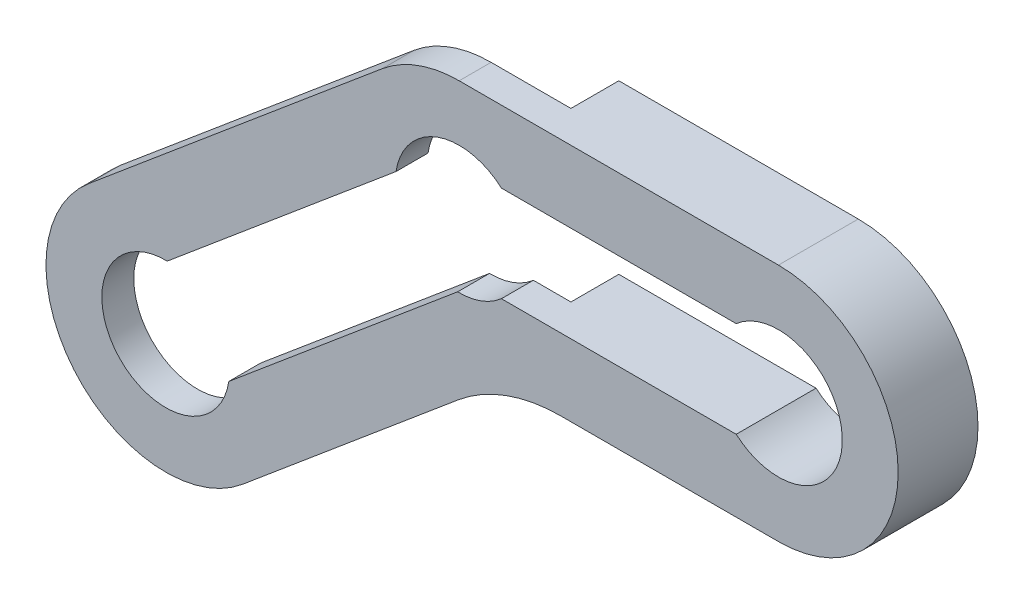
ISO-10303-21;
HEADER;
FILE_DESCRIPTION(('STEP AP214'),'2;1');
FILE_NAME('part.step','',(''),(''),'','','');
FILE_SCHEMA(('AUTOMOTIVE_DESIGN { 1 0 10303 214 1 1 1 1 }'));
ENDSEC;
DATA;
#1=APPLICATION_CONTEXT('core data for automotive mechanical design processes');
#2=APPLICATION_PROTOCOL_DEFINITION('international standard','automotive_design',2000,#1);
#3=PRODUCT_CONTEXT('',#1,'mechanical');
#4=PRODUCT('Part','Part','',(#3));
#5=PRODUCT_RELATED_PRODUCT_CATEGORY('part','',(#4));
#6=PRODUCT_DEFINITION_FORMATION('','',#4);
#7=PRODUCT_DEFINITION_CONTEXT('part definition',#1,'design');
#8=PRODUCT_DEFINITION('design','',#6,#7);
#9=PRODUCT_DEFINITION_SHAPE('','',#8);
#10=(LENGTH_UNIT() NAMED_UNIT(*) SI_UNIT(.MILLI.,.METRE.));
#11=(NAMED_UNIT(*) PLANE_ANGLE_UNIT() SI_UNIT($,.RADIAN.));
#12=(NAMED_UNIT(*) SI_UNIT($,.STERADIAN.) SOLID_ANGLE_UNIT());
#13=UNCERTAINTY_MEASURE_WITH_UNIT(LENGTH_MEASURE(1.E-05),#10,'distance_accuracy_value','');
#14=(GEOMETRIC_REPRESENTATION_CONTEXT(3) GLOBAL_UNCERTAINTY_ASSIGNED_CONTEXT((#13)) GLOBAL_UNIT_ASSIGNED_CONTEXT((#10,
#11,#12)) REPRESENTATION_CONTEXT('',''));
#15=CARTESIAN_POINT('',(0.,0.,0.));
#16=DIRECTION('',(0.,0.,1.));
#17=DIRECTION('',(1.,0.,0.));
#18=AXIS2_PLACEMENT_3D('',#15,#16,#17);
#19=CARTESIAN_POINT('',(0.,0.,0.));
#20=DIRECTION('',(0.,0.,1.));
#21=DIRECTION('',(1.,0.,0.));
#22=AXIS2_PLACEMENT_3D('',#19,#20,#21);
#23=PLANE('',#22);
#24=DIRECTION('',(1.,0.,0.));
#25=VECTOR('',#24,1.);
#26=CARTESIAN_POINT('',(0.,3.,0.));
#27=LINE('',#26,#25);
#28=CARTESIAN_POINT('',(-17.3542486889354,3.,0.));
#29=VERTEX_POINT('',#28);
#30=CARTESIAN_POINT('',(-15.,3.,0.));
#31=VERTEX_POINT('',#30);
#32=EDGE_CURVE('E62',#29,#31,#27,.T.);
#33=ORIENTED_EDGE('',*,*,#32,.F.);
#34=CARTESIAN_POINT('',(-20.,0.,0.));
#35=DIRECTION('',(0.,0.,1.));
#36=DIRECTION('',(1.,0.,0.));
#37=AXIS2_PLACEMENT_3D('',#34,#35,#36);
#38=CIRCLE('',#37,4.);
#39=CARTESIAN_POINT('',(-23.9551259187754,0.597477168292695,0.));
#40=VERTEX_POINT('',#39);
#41=EDGE_CURVE('E371',#29,#40,#38,.T.);
#42=ORIENTED_EDGE('',*,*,#41,.T.);
#43=DIRECTION('',(0.766044443118977,0.64278760968654,0.));
#44=VECTOR('',#43,1.);
#45=CARTESIAN_POINT('',(-10.1918810523903,12.146210859479,0.));
#46=LINE('',#45,#44);
#47=CARTESIAN_POINT('',(-38.2866663741993,-11.4281131420558,0.));
#48=VERTEX_POINT('',#47);
#49=EDGE_CURVE('E288',#48,#40,#46,.T.);
#50=ORIENTED_EDGE('',*,*,#49,.F.);
#51=CARTESIAN_POINT('',(-38.3850666348555,-15.426902632477,0.));
#52=DIRECTION('',(0.,0.,1.));
#53=DIRECTION('',(1.,0.,0.));
#54=AXIS2_PLACEMENT_3D('',#51,#52,#53);
#55=CIRCLE('',#54,4.00000000000001);
#56=CARTESIAN_POINT('',(-34.4299407160801,-16.0243798007697,0.));
#57=VERTEX_POINT('',#56);
#58=EDGE_CURVE('E373',#48,#57,#55,.T.);
#59=ORIENTED_EDGE('',*,*,#58,.T.);
#60=DIRECTION('',(0.766044443118977,0.64278760968654,0.));
#61=VECTOR('',#60,1.);
#62=CARTESIAN_POINT('',(-6.33515539427109,7.54994420076514,0.));
#63=LINE('',#62,#61);
#64=CARTESIAN_POINT('',(-20.0984002606561,-3.99878949042117,0.));
#65=VERTEX_POINT('',#64);
#66=EDGE_CURVE('E280',#57,#65,#63,.T.);
#67=ORIENTED_EDGE('',*,*,#66,.T.);
#68=CARTESIAN_POINT('',(-17.3542486889354,-3.,0.));
#69=VERTEX_POINT('',#68);
#70=EDGE_CURVE('E326',#65,#69,#38,.T.);
#71=ORIENTED_EDGE('',*,*,#70,.T.);
#72=DIRECTION('',(1.,0.,0.));
#73=VECTOR('',#72,1.);
#74=CARTESIAN_POINT('',(0.,-3.,0.));
#75=LINE('',#74,#73);
#76=CARTESIAN_POINT('',(-15.,-3.,0.));
#77=VERTEX_POINT('',#76);
#78=EDGE_CURVE('E180',#69,#77,#75,.T.);
#79=ORIENTED_EDGE('',*,*,#78,.T.);
#80=DIRECTION('',(0.,1.,0.));
#81=VECTOR('',#80,1.);
#82=CARTESIAN_POINT('',(-15.,-7.5,0.));
#83=LINE('',#82,#81);
#84=CARTESIAN_POINT('',(-15.,-7.5,0.));
#85=VERTEX_POINT('',#84);
#86=EDGE_CURVE('E237',#85,#77,#83,.T.);
#87=ORIENTED_EDGE('',*,*,#86,.F.);
#88=DIRECTION('',(-1.,0.,0.));
#89=VECTOR('',#88,1.);
#90=CARTESIAN_POINT('',(0.,-7.5,0.));
#91=LINE('',#90,#89);
#92=CARTESIAN_POINT('',(-13.6305209003414,-7.5,0.));
#93=VERTEX_POINT('',#92);
#94=EDGE_CURVE('E223',#93,#85,#91,.T.);
#95=ORIENTED_EDGE('',*,*,#94,.F.);
#96=CARTESIAN_POINT('',(-13.6305209003414,-17.5,0.));
#97=DIRECTION('',(0.,0.,1.));
#98=DIRECTION('',(1.,0.,0.));
#99=AXIS2_PLACEMENT_3D('',#96,#97,#98);
#100=CIRCLE('',#99,10.);
#101=CARTESIAN_POINT('',(-20.0583969972068,-9.83955556881023,0.));
#102=VERTEX_POINT('',#101);
#103=EDGE_CURVE('E226',#93,#102,#100,.T.);
#104=ORIENTED_EDGE('',*,*,#103,.T.);
#105=DIRECTION('',(0.766044443118977,0.64278760968654,0.));
#106=VECTOR('',#105,1.);
#107=CARTESIAN_POINT('',(-3.44261115068167,4.10274420672975,0.));
#108=LINE('',#107,#106);
#109=CARTESIAN_POINT('',(-33.5641595622064,-21.1722359558693,0.));
#110=VERTEX_POINT('',#109);
#111=EDGE_CURVE('E344',#110,#102,#108,.T.);
#112=ORIENTED_EDGE('',*,*,#111,.F.);
#113=CARTESIAN_POINT('',(-38.3850666348555,-15.426902632477,0.));
#114=DIRECTION('',(0.,0.,1.));
#115=DIRECTION('',(1.,0.,0.));
#116=AXIS2_PLACEMENT_3D('',#113,#114,#115);
#117=CIRCLE('',#116,7.5);
#118=CARTESIAN_POINT('',(-43.2059737075045,-9.68156930908464,0.));
#119=VERTEX_POINT('',#118);
#120=EDGE_CURVE('E378',#119,#110,#117,.T.);
#121=ORIENTED_EDGE('',*,*,#120,.F.);
#122=DIRECTION('',(0.766044443118977,0.64278760968654,0.));
#123=VECTOR('',#122,1.);
#124=CARTESIAN_POINT('',(-13.0844252959798,15.5934108535144,0.));
#125=LINE('',#124,#123);
#126=CARTESIAN_POINT('',(-24.820907072649,5.74533332339233,0.));
#127=VERTEX_POINT('',#126);
#128=EDGE_CURVE('E381',#119,#127,#125,.T.);
#129=ORIENTED_EDGE('',*,*,#128,.T.);
#130=CARTESIAN_POINT('',(-20.,0.,0.));
#131=DIRECTION('',(0.,0.,1.));
#132=DIRECTION('',(1.,0.,0.));
#133=AXIS2_PLACEMENT_3D('',#130,#131,#132);
#134=CIRCLE('',#133,7.5);
#135=CARTESIAN_POINT('',(-20.,7.5,0.));
#136=VERTEX_POINT('',#135);
#137=EDGE_CURVE('E212',#136,#127,#134,.T.);
#138=ORIENTED_EDGE('',*,*,#137,.F.);
#139=DIRECTION('',(-1.,0.,0.));
#140=VECTOR('',#139,1.);
#141=CARTESIAN_POINT('',(0.,7.5,0.));
#142=LINE('',#141,#140);
#143=CARTESIAN_POINT('',(-15.,7.5,0.));
#144=VERTEX_POINT('',#143);
#145=EDGE_CURVE('E215',#144,#136,#142,.T.);
#146=ORIENTED_EDGE('',*,*,#145,.F.);
#147=EDGE_CURVE('E242',#31,#144,#83,.T.);
#148=ORIENTED_EDGE('',*,*,#147,.F.);
#149=EDGE_LOOP('',(#33,#42,#50,#59,#67,#71,#79,#87,#95,#104,#112,#121,#129,#138,#146,#148));
#150=FACE_BOUND('',#149,.T.);
#151=ADVANCED_FACE('F37',(#150),#23,.F.);
#152=CARTESIAN_POINT('',(-20.,0.,2.));
#153=DIRECTION('',(0.,0.,-1.));
#154=DIRECTION('',(-1.,0.,0.));
#155=AXIS2_PLACEMENT_3D('',#152,#153,#154);
#156=CYLINDRICAL_SURFACE('',#155,4.);
#157=ORIENTED_EDGE('',*,*,#41,.F.);
#158=DIRECTION('',(0.,0.,1.));
#159=VECTOR('',#158,1.);
#160=CARTESIAN_POINT('',(-17.3542486889354,3.,-3.000025));
#161=LINE('',#160,#159);
#162=CARTESIAN_POINT('',(-17.3542486889354,3.,2.));
#163=VERTEX_POINT('',#162);
#164=EDGE_CURVE('E261',#29,#163,#161,.T.);
#165=ORIENTED_EDGE('',*,*,#164,.T.);
#166=CARTESIAN_POINT('',(-20.,0.,2.));
#167=DIRECTION('',(0.,0.,1.));
#168=DIRECTION('',(1.,0.,0.));
#169=AXIS2_PLACEMENT_3D('',#166,#167,#168);
#170=CIRCLE('',#169,4.);
#171=CARTESIAN_POINT('',(-23.9551259187754,0.597477168292696,2.));
#172=VERTEX_POINT('',#171);
#173=EDGE_CURVE('E202',#163,#172,#170,.T.);
#174=ORIENTED_EDGE('',*,*,#173,.T.);
#175=DIRECTION('',(0.,0.,1.));
#176=VECTOR('',#175,1.);
#177=CARTESIAN_POINT('',(-23.9551259187754,0.597477168292695,-3.000025));
#178=LINE('',#177,#176);
#179=EDGE_CURVE('E281',#40,#172,#178,.T.);
#180=ORIENTED_EDGE('',*,*,#179,.F.);
#181=EDGE_LOOP('',(#157,#165,#174,#180));
#182=FACE_BOUND('',#181,.T.);
#183=ADVANCED_FACE('F394',(#182),#156,.F.);
#184=CARTESIAN_POINT('',(0.,0.,2.));
#185=DIRECTION('',(0.,0.,1.));
#186=DIRECTION('',(1.,0.,0.));
#187=AXIS2_PLACEMENT_3D('',#184,#185,#186);
#188=PLANE('',#187);
#189=DIRECTION('',(-1.,0.,0.));
#190=VECTOR('',#189,1.);
#191=CARTESIAN_POINT('',(0.,7.5,2.));
#192=LINE('',#191,#190);
#193=CARTESIAN_POINT('',(0.,7.5,2.));
#194=VERTEX_POINT('',#193);
#195=CARTESIAN_POINT('',(-20.,7.5,2.));
#196=VERTEX_POINT('',#195);
#197=EDGE_CURVE('E318',#194,#196,#192,.T.);
#198=ORIENTED_EDGE('',*,*,#197,.T.);
#199=CARTESIAN_POINT('',(-20.,0.,2.));
#200=DIRECTION('',(0.,0.,1.));
#201=DIRECTION('',(1.,0.,0.));
#202=AXIS2_PLACEMENT_3D('',#199,#200,#201);
#203=CIRCLE('',#202,7.5);
#204=CARTESIAN_POINT('',(-24.820907072649,5.74533332339233,2.));
#205=VERTEX_POINT('',#204);
#206=EDGE_CURVE('E370',#196,#205,#203,.T.);
#207=ORIENTED_EDGE('',*,*,#206,.T.);
#208=DIRECTION('',(0.766044443118977,0.64278760968654,0.));
#209=VECTOR('',#208,1.);
#210=CARTESIAN_POINT('',(-13.0844252959798,15.5934108535144,2.));
#211=LINE('',#210,#209);
#212=CARTESIAN_POINT('',(-43.2059737075045,-9.68156930908464,2.));
#213=VERTEX_POINT('',#212);
#214=EDGE_CURVE('E367',#213,#205,#211,.T.);
#215=ORIENTED_EDGE('',*,*,#214,.F.);
#216=CARTESIAN_POINT('',(-38.3850666348555,-15.426902632477,2.));
#217=DIRECTION('',(0.,0.,1.));
#218=DIRECTION('',(1.,0.,0.));
#219=AXIS2_PLACEMENT_3D('',#216,#217,#218);
#220=CIRCLE('',#219,7.5);
#221=CARTESIAN_POINT('',(-33.5641595622064,-21.1722359558693,2.));
#222=VERTEX_POINT('',#221);
#223=EDGE_CURVE('E353',#213,#222,#220,.T.);
#224=ORIENTED_EDGE('',*,*,#223,.T.);
#225=DIRECTION('',(0.766044443118977,0.64278760968654,0.));
#226=VECTOR('',#225,1.);
#227=CARTESIAN_POINT('',(-3.44261115068167,4.10274420672975,2.));
#228=LINE('',#227,#226);
#229=CARTESIAN_POINT('',(-20.0583969972068,-9.83955556881023,2.));
#230=VERTEX_POINT('',#229);
#231=EDGE_CURVE('E342',#222,#230,#228,.T.);
#232=ORIENTED_EDGE('',*,*,#231,.T.);
#233=CARTESIAN_POINT('',(-13.6305209003414,-17.5,2.));
#234=DIRECTION('',(0.,0.,1.));
#235=DIRECTION('',(1.,0.,0.));
#236=AXIS2_PLACEMENT_3D('',#233,#234,#235);
#237=CIRCLE('',#236,10.);
#238=CARTESIAN_POINT('',(-13.6305209003414,-7.5,2.));
#239=VERTEX_POINT('',#238);
#240=EDGE_CURVE('E219',#230,#239,#237,.F.);
#241=ORIENTED_EDGE('',*,*,#240,.T.);
#242=DIRECTION('',(-1.,0.,0.));
#243=VECTOR('',#242,1.);
#244=CARTESIAN_POINT('',(0.,-7.5,2.));
#245=LINE('',#244,#243);
#246=CARTESIAN_POINT('',(0.,-7.5,2.));
#247=VERTEX_POINT('',#246);
#248=EDGE_CURVE('E355',#247,#239,#245,.T.);
#249=ORIENTED_EDGE('',*,*,#248,.F.);
#250=CARTESIAN_POINT('',(0.,0.,2.));
#251=DIRECTION('',(0.,0.,1.));
#252=DIRECTION('',(1.,0.,0.));
#253=AXIS2_PLACEMENT_3D('',#250,#251,#252);
#254=CIRCLE('',#253,7.5);
#255=EDGE_CURVE('E363',#247,#194,#254,.T.);
#256=ORIENTED_EDGE('',*,*,#255,.T.);
#257=EDGE_LOOP('',(#198,#207,#215,#224,#232,#241,#249,#256));
#258=FACE_BOUND('',#257,.T.);
#259=ORIENTED_EDGE('',*,*,#173,.F.);
#260=DIRECTION('',(1.,0.,0.));
#261=VECTOR('',#260,1.);
#262=CARTESIAN_POINT('',(0.,3.,2.));
#263=LINE('',#262,#261);
#264=CARTESIAN_POINT('',(-2.64575131106459,3.,2.));
#265=VERTEX_POINT('',#264);
#266=EDGE_CURVE('E186',#163,#265,#263,.T.);
#267=ORIENTED_EDGE('',*,*,#266,.T.);
#268=CARTESIAN_POINT('',(0.,0.,2.));
#269=DIRECTION('',(0.,0.,1.));
#270=DIRECTION('',(1.,0.,0.));
#271=AXIS2_PLACEMENT_3D('',#268,#269,#270);
#272=CIRCLE('',#271,4.);
#273=CARTESIAN_POINT('',(-2.64575131106459,-3.,2.));
#274=VERTEX_POINT('',#273);
#275=EDGE_CURVE('E197',#274,#265,#272,.T.);
#276=ORIENTED_EDGE('',*,*,#275,.F.);
#277=DIRECTION('',(1.,0.,0.));
#278=VECTOR('',#277,1.);
#279=CARTESIAN_POINT('',(0.,-3.,2.));
#280=LINE('',#279,#278);
#281=CARTESIAN_POINT('',(-17.3542486889354,-3.,2.));
#282=VERTEX_POINT('',#281);
#283=EDGE_CURVE('E177',#282,#274,#280,.T.);
#284=ORIENTED_EDGE('',*,*,#283,.F.);
#285=CARTESIAN_POINT('',(-20.0984002606561,-3.99878949042117,2.));
#286=VERTEX_POINT('',#285);
#287=EDGE_CURVE('E194',#286,#282,#170,.T.);
#288=ORIENTED_EDGE('',*,*,#287,.F.);
#289=DIRECTION('',(0.766044443118977,0.64278760968654,0.));
#290=VECTOR('',#289,1.);
#291=CARTESIAN_POINT('',(-6.33515539427109,7.54994420076514,2.));
#292=LINE('',#291,#290);
#293=CARTESIAN_POINT('',(-34.42994071608,-16.0243798007697,2.));
#294=VERTEX_POINT('',#293);
#295=EDGE_CURVE('E271',#294,#286,#292,.T.);
#296=ORIENTED_EDGE('',*,*,#295,.F.);
#297=CARTESIAN_POINT('',(-38.3850666348555,-15.426902632477,2.));
#298=DIRECTION('',(0.,0.,1.));
#299=DIRECTION('',(1.,0.,0.));
#300=AXIS2_PLACEMENT_3D('',#297,#298,#299);
#301=CIRCLE('',#300,4.00000000000001);
#302=CARTESIAN_POINT('',(-38.2866663741993,-11.4281131420558,2.));
#303=VERTEX_POINT('',#302);
#304=EDGE_CURVE('E206',#303,#294,#301,.T.);
#305=ORIENTED_EDGE('',*,*,#304,.F.);
#306=DIRECTION('',(0.766044443118977,0.64278760968654,0.));
#307=VECTOR('',#306,1.);
#308=CARTESIAN_POINT('',(-10.1918810523903,12.146210859479,2.));
#309=LINE('',#308,#307);
#310=EDGE_CURVE('E273',#303,#172,#309,.T.);
#311=ORIENTED_EDGE('',*,*,#310,.T.);
#312=EDGE_LOOP('',(#259,#267,#276,#284,#288,#296,#305,#311));
#313=FACE_BOUND('',#312,.T.);
#314=ADVANCED_FACE('F192',(#258,#313),#188,.T.);
#315=CARTESIAN_POINT('',(0.,0.,2.));
#316=DIRECTION('',(0.,0.,-1.));
#317=DIRECTION('',(-1.,0.,0.));
#318=AXIS2_PLACEMENT_3D('',#315,#316,#317);
#319=CYLINDRICAL_SURFACE('',#318,4.);
#320=ORIENTED_EDGE('',*,*,#275,.T.);
#321=DIRECTION('',(0.,0.,1.));
#322=VECTOR('',#321,1.);
#323=CARTESIAN_POINT('',(-2.64575131106459,3.,-3.000025));
#324=LINE('',#323,#322);
#325=CARTESIAN_POINT('',(-2.64575131106459,3.,-3.00000625));
#326=VERTEX_POINT('',#325);
#327=EDGE_CURVE('E264',#326,#265,#324,.T.);
#328=ORIENTED_EDGE('',*,*,#327,.F.);
#329=CARTESIAN_POINT('',(0.,0.,-3.));
#330=DIRECTION('',(0.,0.,-1.));
#331=DIRECTION('',(-1.,0.,0.));
#332=AXIS2_PLACEMENT_3D('',#329,#330,#331);
#333=CIRCLE('',#332,4.);
#334=CARTESIAN_POINT('',(-2.64575131106459,-3.,-3.00000625));
#335=VERTEX_POINT('',#334);
#336=EDGE_CURVE('E41',#326,#335,#333,.T.);
#337=ORIENTED_EDGE('',*,*,#336,.T.);
#338=DIRECTION('',(0.,0.,1.));
#339=VECTOR('',#338,1.);
#340=CARTESIAN_POINT('',(-2.64575131106459,-3.,-3.000025));
#341=LINE('',#340,#339);
#342=EDGE_CURVE('E185',#335,#274,#341,.T.);
#343=ORIENTED_EDGE('',*,*,#342,.T.);
#344=EDGE_LOOP('',(#320,#328,#337,#343));
#345=FACE_BOUND('',#344,.T.);
#346=ADVANCED_FACE('F423',(#345),#319,.F.);
#347=CARTESIAN_POINT('',(0.,0.,-3.));
#348=DIRECTION('',(0.,0.,-1.));
#349=DIRECTION('',(-1.,0.,0.));
#350=AXIS2_PLACEMENT_3D('',#347,#348,#349);
#351=PLANE('',#350);
#352=ORIENTED_EDGE('',*,*,#336,.F.);
#353=DIRECTION('',(-1.,0.,0.));
#354=VECTOR('',#353,1.);
#355=CARTESIAN_POINT('',(0.,3.,-3.));
#356=LINE('',#355,#354);
#357=CARTESIAN_POINT('',(-15.,3.,-3.));
#358=VERTEX_POINT('',#357);
#359=EDGE_CURVE('E268',#326,#358,#356,.T.);
#360=ORIENTED_EDGE('',*,*,#359,.T.);
#361=DIRECTION('',(0.,1.,0.));
#362=VECTOR('',#361,1.);
#363=CARTESIAN_POINT('',(-15.,-7.5,-3.));
#364=LINE('',#363,#362);
#365=CARTESIAN_POINT('',(-15.,7.5,-3.));
#366=VERTEX_POINT('',#365);
#367=EDGE_CURVE('E295',#358,#366,#364,.T.);
#368=ORIENTED_EDGE('',*,*,#367,.T.);
#369=DIRECTION('',(1.,0.,0.));
#370=VECTOR('',#369,1.);
#371=CARTESIAN_POINT('',(-15.,7.5,-3.));
#372=LINE('',#371,#370);
#373=CARTESIAN_POINT('',(0.,7.5,-3.));
#374=VERTEX_POINT('',#373);
#375=EDGE_CURVE('E248',#366,#374,#372,.T.);
#376=ORIENTED_EDGE('',*,*,#375,.T.);
#377=CARTESIAN_POINT('',(0.,0.,-3.));
#378=DIRECTION('',(0.,0.,-1.));
#379=DIRECTION('',(-1.,0.,0.));
#380=AXIS2_PLACEMENT_3D('',#377,#378,#379);
#381=CIRCLE('',#380,7.5);
#382=CARTESIAN_POINT('',(0.,-7.5,-3.));
#383=VERTEX_POINT('',#382);
#384=EDGE_CURVE('E241',#374,#383,#381,.T.);
#385=ORIENTED_EDGE('',*,*,#384,.T.);
#386=DIRECTION('',(-1.,0.,0.));
#387=VECTOR('',#386,1.);
#388=CARTESIAN_POINT('',(0.,-7.5,-3.));
#389=LINE('',#388,#387);
#390=CARTESIAN_POINT('',(-15.,-7.5,-3.));
#391=VERTEX_POINT('',#390);
#392=EDGE_CURVE('E294',#383,#391,#389,.T.);
#393=ORIENTED_EDGE('',*,*,#392,.T.);
#394=CARTESIAN_POINT('',(-15.,-3.,-3.));
#395=VERTEX_POINT('',#394);
#396=EDGE_CURVE('E296',#391,#395,#364,.T.);
#397=ORIENTED_EDGE('',*,*,#396,.T.);
#398=DIRECTION('',(-1.,0.,0.));
#399=VECTOR('',#398,1.);
#400=CARTESIAN_POINT('',(0.,-3.,-3.));
#401=LINE('',#400,#399);
#402=EDGE_CURVE('E55',#335,#395,#401,.T.);
#403=ORIENTED_EDGE('',*,*,#402,.F.);
#404=EDGE_LOOP('',(#352,#360,#368,#376,#385,#393,#397,#403));
#405=FACE_BOUND('',#404,.T.);
#406=ADVANCED_FACE('F304',(#405),#351,.T.);
#407=CARTESIAN_POINT('',(-15.,-7.5,-3.));
#408=DIRECTION('',(1.,0.,0.));
#409=DIRECTION('',(0.,0.,-1.));
#410=AXIS2_PLACEMENT_3D('',#407,#408,#409);
#411=PLANE('',#410);
#412=DIRECTION('',(0.,0.,-1.));
#413=VECTOR('',#412,1.);
#414=CARTESIAN_POINT('',(-15.,3.,-3.));
#415=LINE('',#414,#413);
#416=EDGE_CURVE('E11',#31,#358,#415,.T.);
#417=ORIENTED_EDGE('',*,*,#416,.F.);
#418=ORIENTED_EDGE('',*,*,#147,.T.);
#419=DIRECTION('',(0.,0.,1.));
#420=VECTOR('',#419,1.);
#421=CARTESIAN_POINT('',(-15.,7.5,-3.));
#422=LINE('',#421,#420);
#423=EDGE_CURVE('E243',#366,#144,#422,.T.);
#424=ORIENTED_EDGE('',*,*,#423,.F.);
#425=ORIENTED_EDGE('',*,*,#367,.F.);
#426=EDGE_LOOP('',(#417,#418,#424,#425));
#427=FACE_BOUND('',#426,.T.);
#428=ADVANCED_FACE('F309',(#427),#411,.F.);
#429=DIRECTION('',(0.,0.,1.));
#430=VECTOR('',#429,1.);
#431=CARTESIAN_POINT('',(-17.3542486889354,-3.,-3.000025));
#432=LINE('',#431,#430);
#433=EDGE_CURVE('E174',#69,#282,#432,.T.);
#434=ORIENTED_EDGE('',*,*,#433,.F.);
#435=ORIENTED_EDGE('',*,*,#70,.F.);
#436=DIRECTION('',(0.,0.,1.));
#437=VECTOR('',#436,1.);
#438=CARTESIAN_POINT('',(-20.0984002606561,-3.99878949042117,-3.000025));
#439=LINE('',#438,#437);
#440=EDGE_CURVE('E201',#65,#286,#439,.T.);
#441=ORIENTED_EDGE('',*,*,#440,.T.);
#442=ORIENTED_EDGE('',*,*,#287,.T.);
#443=EDGE_LOOP('',(#434,#435,#441,#442));
#444=FACE_BOUND('',#443,.T.);
#445=ADVANCED_FACE('F200',(#444),#156,.F.);
#446=CARTESIAN_POINT('',(-38.3850666348555,-15.426902632477,2.));
#447=DIRECTION('',(0.,0.,-1.));
#448=DIRECTION('',(-1.,0.,0.));
#449=AXIS2_PLACEMENT_3D('',#446,#447,#448);
#450=CYLINDRICAL_SURFACE('',#449,4.00000000000001);
#451=ORIENTED_EDGE('',*,*,#58,.F.);
#452=DIRECTION('',(0.,0.,1.));
#453=VECTOR('',#452,1.);
#454=CARTESIAN_POINT('',(-38.2866663741993,-11.4281131420558,-3.000025));
#455=LINE('',#454,#453);
#456=EDGE_CURVE('E277',#48,#303,#455,.T.);
#457=ORIENTED_EDGE('',*,*,#456,.T.);
#458=ORIENTED_EDGE('',*,*,#304,.T.);
#459=DIRECTION('',(0.,0.,1.));
#460=VECTOR('',#459,1.);
#461=CARTESIAN_POINT('',(-34.4299407160801,-16.0243798007697,-3.000025));
#462=LINE('',#461,#460);
#463=EDGE_CURVE('E276',#57,#294,#462,.T.);
#464=ORIENTED_EDGE('',*,*,#463,.F.);
#465=EDGE_LOOP('',(#451,#457,#458,#464));
#466=FACE_BOUND('',#465,.T.);
#467=ADVANCED_FACE('F401',(#466),#450,.F.);
#468=CARTESIAN_POINT('',(0.,7.5,2.));
#469=DIRECTION('',(0.,-1.,0.));
#470=DIRECTION('',(1.,0.,0.));
#471=AXIS2_PLACEMENT_3D('',#468,#469,#470);
#472=PLANE('',#471);
#473=DIRECTION('',(0.,0.,-1.));
#474=VECTOR('',#473,1.);
#475=CARTESIAN_POINT('',(0.,7.5,2.));
#476=LINE('',#475,#474);
#477=EDGE_CURVE('E204',#194,#374,#476,.T.);
#478=ORIENTED_EDGE('',*,*,#477,.T.);
#479=ORIENTED_EDGE('',*,*,#375,.F.);
#480=ORIENTED_EDGE('',*,*,#423,.T.);
#481=ORIENTED_EDGE('',*,*,#145,.T.);
#482=DIRECTION('',(0.,0.,-1.));
#483=VECTOR('',#482,1.);
#484=CARTESIAN_POINT('',(-20.,7.5,2.));
#485=LINE('',#484,#483);
#486=EDGE_CURVE('E234',#196,#136,#485,.T.);
#487=ORIENTED_EDGE('',*,*,#486,.F.);
#488=ORIENTED_EDGE('',*,*,#197,.F.);
#489=EDGE_LOOP('',(#478,#479,#480,#481,#487,#488));
#490=FACE_BOUND('',#489,.T.);
#491=ADVANCED_FACE('F313',(#490),#472,.F.);
#492=CARTESIAN_POINT('',(-20.,0.,2.));
#493=DIRECTION('',(0.,0.,-1.));
#494=DIRECTION('',(-1.,0.,0.));
#495=AXIS2_PLACEMENT_3D('',#492,#493,#494);
#496=CYLINDRICAL_SURFACE('',#495,7.5);
#497=ORIENTED_EDGE('',*,*,#137,.T.);
#498=DIRECTION('',(0.,0.,-1.));
#499=VECTOR('',#498,1.);
#500=CARTESIAN_POINT('',(-24.820907072649,5.74533332339233,2.));
#501=LINE('',#500,#499);
#502=EDGE_CURVE('E333',#205,#127,#501,.T.);
#503=ORIENTED_EDGE('',*,*,#502,.F.);
#504=ORIENTED_EDGE('',*,*,#206,.F.);
#505=ORIENTED_EDGE('',*,*,#486,.T.);
#506=EDGE_LOOP('',(#497,#503,#504,#505));
#507=FACE_BOUND('',#506,.T.);
#508=ADVANCED_FACE('F389',(#507),#496,.T.);
#509=CARTESIAN_POINT('',(-13.0844252959798,15.5934108535144,2.));
#510=DIRECTION('',(-0.64278760968654,0.766044443118977,0.));
#511=DIRECTION('',(-0.766044443118977,-0.64278760968654,0.));
#512=AXIS2_PLACEMENT_3D('',#509,#510,#511);
#513=PLANE('',#512);
#514=ORIENTED_EDGE('',*,*,#128,.F.);
#515=DIRECTION('',(0.,0.,-1.));
#516=VECTOR('',#515,1.);
#517=CARTESIAN_POINT('',(-43.2059737075045,-9.68156930908464,2.));
#518=LINE('',#517,#516);
#519=EDGE_CURVE('E331',#213,#119,#518,.T.);
#520=ORIENTED_EDGE('',*,*,#519,.F.);
#521=ORIENTED_EDGE('',*,*,#214,.T.);
#522=ORIENTED_EDGE('',*,*,#502,.T.);
#523=EDGE_LOOP('',(#514,#520,#521,#522));
#524=FACE_BOUND('',#523,.T.);
#525=ADVANCED_FACE('F440',(#524),#513,.T.);
#526=CARTESIAN_POINT('',(-38.3850666348555,-15.426902632477,2.));
#527=DIRECTION('',(0.,0.,-1.));
#528=DIRECTION('',(-1.,0.,0.));
#529=AXIS2_PLACEMENT_3D('',#526,#527,#528);
#530=CYLINDRICAL_SURFACE('',#529,7.5);
#531=ORIENTED_EDGE('',*,*,#120,.T.);
#532=DIRECTION('',(0.,0.,-1.));
#533=VECTOR('',#532,1.);
#534=CARTESIAN_POINT('',(-33.5641595622064,-21.1722359558693,2.));
#535=LINE('',#534,#533);
#536=EDGE_CURVE('E323',#222,#110,#535,.T.);
#537=ORIENTED_EDGE('',*,*,#536,.F.);
#538=ORIENTED_EDGE('',*,*,#223,.F.);
#539=ORIENTED_EDGE('',*,*,#519,.T.);
#540=EDGE_LOOP('',(#531,#537,#538,#539));
#541=FACE_BOUND('',#540,.T.);
#542=ADVANCED_FACE('F437',(#541),#530,.T.);
#543=CARTESIAN_POINT('',(-3.44261115068167,4.10274420672975,2.));
#544=DIRECTION('',(-0.642787609686541,0.766044443118977,0.));
#545=DIRECTION('',(-0.766044443118977,-0.642787609686541,0.));
#546=AXIS2_PLACEMENT_3D('',#543,#544,#545);
#547=PLANE('',#546);
#548=ORIENTED_EDGE('',*,*,#111,.T.);
#549=DIRECTION('',(0.,0.,-1.));
#550=VECTOR('',#549,1.);
#551=CARTESIAN_POINT('',(-20.0583969972068,-9.83955556881023,2.));
#552=LINE('',#551,#550);
#553=EDGE_CURVE('E228',#102,#230,#552,.F.);
#554=ORIENTED_EDGE('',*,*,#553,.T.);
#555=ORIENTED_EDGE('',*,*,#231,.F.);
#556=ORIENTED_EDGE('',*,*,#536,.T.);
#557=EDGE_LOOP('',(#548,#554,#555,#556));
#558=FACE_BOUND('',#557,.T.);
#559=ADVANCED_FACE('F341',(#558),#547,.F.);
#560=CARTESIAN_POINT('',(0.,-7.5,2.));
#561=DIRECTION('',(0.,-1.,0.));
#562=DIRECTION('',(1.,0.,0.));
#563=AXIS2_PLACEMENT_3D('',#560,#561,#562);
#564=PLANE('',#563);
#565=ORIENTED_EDGE('',*,*,#248,.T.);
#566=DIRECTION('',(0.,0.,-1.));
#567=VECTOR('',#566,1.);
#568=CARTESIAN_POINT('',(-13.6305209003414,-7.5,2.));
#569=LINE('',#568,#567);
#570=EDGE_CURVE('E231',#239,#93,#569,.T.);
#571=ORIENTED_EDGE('',*,*,#570,.T.);
#572=ORIENTED_EDGE('',*,*,#94,.T.);
#573=DIRECTION('',(0.,0.,1.));
#574=VECTOR('',#573,1.);
#575=CARTESIAN_POINT('',(-15.,-7.5,-3.));
#576=LINE('',#575,#574);
#577=EDGE_CURVE('E218',#391,#85,#576,.T.);
#578=ORIENTED_EDGE('',*,*,#577,.F.);
#579=ORIENTED_EDGE('',*,*,#392,.F.);
#580=DIRECTION('',(0.,0.,-1.));
#581=VECTOR('',#580,1.);
#582=CARTESIAN_POINT('',(0.,-7.5,2.));
#583=LINE('',#582,#581);
#584=EDGE_CURVE('E321',#247,#383,#583,.T.);
#585=ORIENTED_EDGE('',*,*,#584,.F.);
#586=EDGE_LOOP('',(#565,#571,#572,#578,#579,#585));
#587=FACE_BOUND('',#586,.T.);
#588=ADVANCED_FACE('F359',(#587),#564,.T.);
#589=CARTESIAN_POINT('',(0.,0.,2.));
#590=DIRECTION('',(0.,0.,-1.));
#591=DIRECTION('',(-1.,0.,0.));
#592=AXIS2_PLACEMENT_3D('',#589,#590,#591);
#593=CYLINDRICAL_SURFACE('',#592,7.5);
#594=ORIENTED_EDGE('',*,*,#584,.T.);
#595=ORIENTED_EDGE('',*,*,#384,.F.);
#596=ORIENTED_EDGE('',*,*,#477,.F.);
#597=ORIENTED_EDGE('',*,*,#255,.F.);
#598=EDGE_LOOP('',(#594,#595,#596,#597));
#599=FACE_BOUND('',#598,.T.);
#600=ADVANCED_FACE('F430',(#599),#593,.T.);
#601=CARTESIAN_POINT('',(-13.6305209003414,-17.5,2.));
#602=DIRECTION('',(0.,0.,-1.));
#603=DIRECTION('',(-1.,0.,0.));
#604=AXIS2_PLACEMENT_3D('',#601,#602,#603);
#605=CYLINDRICAL_SURFACE('',#604,10.);
#606=ORIENTED_EDGE('',*,*,#240,.F.);
#607=ORIENTED_EDGE('',*,*,#553,.F.);
#608=ORIENTED_EDGE('',*,*,#103,.F.);
#609=ORIENTED_EDGE('',*,*,#570,.F.);
#610=EDGE_LOOP('',(#606,#607,#608,#609));
#611=FACE_BOUND('',#610,.T.);
#612=ADVANCED_FACE('F39',(#611),#605,.F.);
#613=ORIENTED_EDGE('',*,*,#86,.T.);
#614=DIRECTION('',(0.,0.,-1.));
#615=VECTOR('',#614,1.);
#616=CARTESIAN_POINT('',(-15.,-3.,-3.));
#617=LINE('',#616,#615);
#618=EDGE_CURVE('E47',#77,#395,#617,.T.);
#619=ORIENTED_EDGE('',*,*,#618,.T.);
#620=ORIENTED_EDGE('',*,*,#396,.F.);
#621=ORIENTED_EDGE('',*,*,#577,.T.);
#622=EDGE_LOOP('',(#613,#619,#620,#621));
#623=FACE_BOUND('',#622,.T.);
#624=ADVANCED_FACE('F405',(#623),#411,.F.);
#625=CARTESIAN_POINT('',(-6.33515539427109,7.54994420076514,-3.000025));
#626=DIRECTION('',(0.64278760968654,-0.766044443118977,0.));
#627=DIRECTION('',(0.766044443118977,0.64278760968654,0.));
#628=AXIS2_PLACEMENT_3D('',#625,#626,#627);
#629=PLANE('',#628);
#630=ORIENTED_EDGE('',*,*,#463,.T.);
#631=ORIENTED_EDGE('',*,*,#295,.T.);
#632=ORIENTED_EDGE('',*,*,#440,.F.);
#633=ORIENTED_EDGE('',*,*,#66,.F.);
#634=EDGE_LOOP('',(#630,#631,#632,#633));
#635=FACE_BOUND('',#634,.T.);
#636=ADVANCED_FACE('F403',(#635),#629,.F.);
#637=CARTESIAN_POINT('',(-10.1918810523903,12.146210859479,-3.000025));
#638=DIRECTION('',(0.64278760968654,-0.766044443118977,0.));
#639=DIRECTION('',(0.766044443118977,0.64278760968654,0.));
#640=AXIS2_PLACEMENT_3D('',#637,#638,#639);
#641=PLANE('',#640);
#642=ORIENTED_EDGE('',*,*,#49,.T.);
#643=ORIENTED_EDGE('',*,*,#179,.T.);
#644=ORIENTED_EDGE('',*,*,#310,.F.);
#645=ORIENTED_EDGE('',*,*,#456,.F.);
#646=EDGE_LOOP('',(#642,#643,#644,#645));
#647=FACE_BOUND('',#646,.T.);
#648=ADVANCED_FACE('F396',(#647),#641,.T.);
#649=CARTESIAN_POINT('',(0.,-3.,-3.000025));
#650=DIRECTION('',(0.,-1.,0.));
#651=DIRECTION('',(0.,0.,-1.));
#652=AXIS2_PLACEMENT_3D('',#649,#650,#651);
#653=PLANE('',#652);
#654=ORIENTED_EDGE('',*,*,#433,.T.);
#655=ORIENTED_EDGE('',*,*,#283,.T.);
#656=ORIENTED_EDGE('',*,*,#342,.F.);
#657=ORIENTED_EDGE('',*,*,#402,.T.);
#658=ORIENTED_EDGE('',*,*,#618,.F.);
#659=ORIENTED_EDGE('',*,*,#78,.F.);
#660=EDGE_LOOP('',(#654,#655,#656,#657,#658,#659));
#661=FACE_BOUND('',#660,.T.);
#662=ADVANCED_FACE('F176',(#661),#653,.F.);
#663=CARTESIAN_POINT('',(0.,3.,-3.000025));
#664=DIRECTION('',(0.,-1.,0.));
#665=DIRECTION('',(0.,0.,-1.));
#666=AXIS2_PLACEMENT_3D('',#663,#664,#665);
#667=PLANE('',#666);
#668=ORIENTED_EDGE('',*,*,#32,.T.);
#669=ORIENTED_EDGE('',*,*,#416,.T.);
#670=ORIENTED_EDGE('',*,*,#359,.F.);
#671=ORIENTED_EDGE('',*,*,#327,.T.);
#672=ORIENTED_EDGE('',*,*,#266,.F.);
#673=ORIENTED_EDGE('',*,*,#164,.F.);
#674=EDGE_LOOP('',(#668,#669,#670,#671,#672,#673));
#675=FACE_BOUND('',#674,.T.);
#676=ADVANCED_FACE('F507',(#675),#667,.T.);
#677=CLOSED_SHELL('',(#151,#183,#314,#346,#406,#428,#445,#467,#491,#508,#525,#542,#559,#588,
#600,#612,#624,#636,#648,#662,#676));
#678=MANIFOLD_SOLID_BREP('B2',#677);
#679=ADVANCED_BREP_SHAPE_REPRESENTATION('',(#18,#678),#14);
#680=SHAPE_DEFINITION_REPRESENTATION(#9,#679);
ENDSEC;
END-ISO-10303-21;
